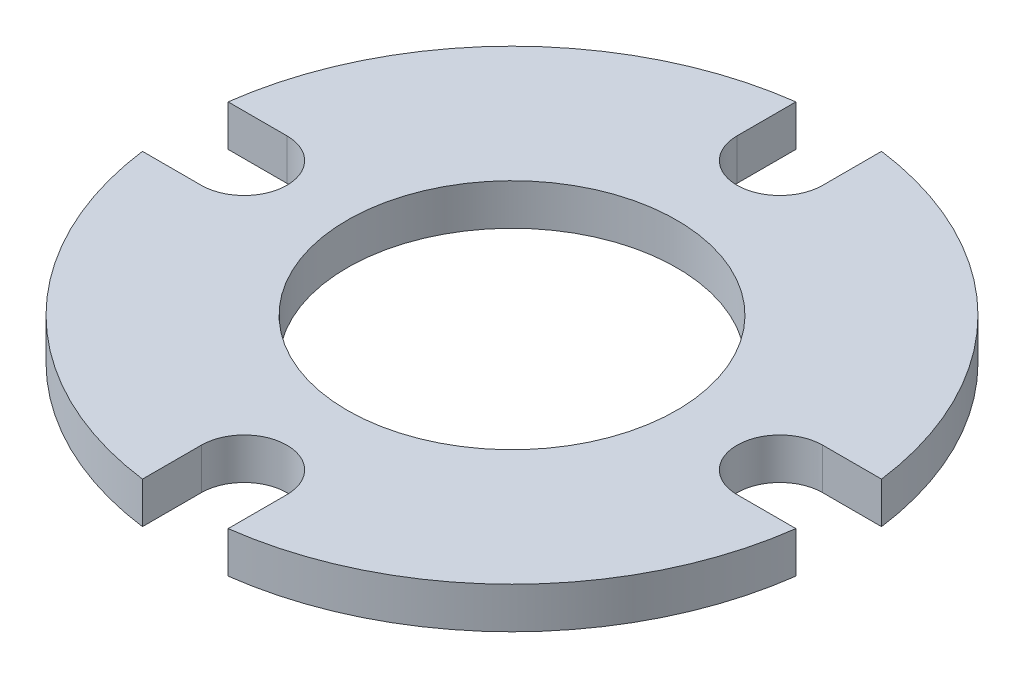
ISO-10303-21;
HEADER;
FILE_DESCRIPTION(('STEP AP214'),'2;1');
FILE_NAME('part.step','',(''),(''),'','','');
FILE_SCHEMA(('AUTOMOTIVE_DESIGN { 1 0 10303 214 1 1 1 1 }'));
ENDSEC;
DATA;
#1=APPLICATION_CONTEXT('core data for automotive mechanical design processes');
#2=APPLICATION_PROTOCOL_DEFINITION('international standard','automotive_design',2000,#1);
#3=PRODUCT_CONTEXT('',#1,'mechanical');
#4=PRODUCT('Part','Part','',(#3));
#5=PRODUCT_RELATED_PRODUCT_CATEGORY('part','',(#4));
#6=PRODUCT_DEFINITION_FORMATION('','',#4);
#7=PRODUCT_DEFINITION_CONTEXT('part definition',#1,'design');
#8=PRODUCT_DEFINITION('design','',#6,#7);
#9=PRODUCT_DEFINITION_SHAPE('','',#8);
#10=(LENGTH_UNIT() NAMED_UNIT(*) SI_UNIT(.MILLI.,.METRE.));
#11=(NAMED_UNIT(*) PLANE_ANGLE_UNIT() SI_UNIT($,.RADIAN.));
#12=(NAMED_UNIT(*) SI_UNIT($,.STERADIAN.) SOLID_ANGLE_UNIT());
#13=UNCERTAINTY_MEASURE_WITH_UNIT(LENGTH_MEASURE(1.E-05),#10,'distance_accuracy_value','');
#14=(GEOMETRIC_REPRESENTATION_CONTEXT(3) GLOBAL_UNCERTAINTY_ASSIGNED_CONTEXT((#13)) GLOBAL_UNIT_ASSIGNED_CONTEXT((#10,
#11,#12)) REPRESENTATION_CONTEXT('',''));
#15=CARTESIAN_POINT('',(0.,0.,0.));
#16=DIRECTION('',(0.,0.,1.));
#17=DIRECTION('',(1.,0.,0.));
#18=AXIS2_PLACEMENT_3D('',#15,#16,#17);
#19=CARTESIAN_POINT('',(0.813,0.0625,0.));
#20=DIRECTION('',(0.,1.,0.));
#21=DIRECTION('',(0.,0.,1.));
#22=AXIS2_PLACEMENT_3D('',#19,#20,#21);
#23=PLANE('',#22);
#24=CARTESIAN_POINT('',(0.813,0.0625,0.));
#25=DIRECTION('',(0.,-1.,0.));
#26=DIRECTION('',(0.,0.,1.));
#27=AXIS2_PLACEMENT_3D('',#24,#25,#26);
#28=CIRCLE('',#27,0.13);
#29=CARTESIAN_POINT('',(0.813,0.0625,0.13));
#30=VERTEX_POINT('',#29);
#31=CARTESIAN_POINT('',(0.813,0.0625,-0.13));
#32=VERTEX_POINT('',#31);
#33=EDGE_CURVE('E213',#30,#32,#28,.T.);
#34=ORIENTED_EDGE('',*,*,#33,.T.);
#35=DIRECTION('',(1.,0.,0.));
#36=VECTOR('',#35,1.);
#37=CARTESIAN_POINT('',(0.813,0.0625,-0.13));
#38=LINE('',#37,#36);
#39=CARTESIAN_POINT('',(0.991513993849809,0.0625,-0.13));
#40=VERTEX_POINT('',#39);
#41=EDGE_CURVE('E121',#32,#40,#38,.T.);
#42=ORIENTED_EDGE('',*,*,#41,.T.);
#43=CARTESIAN_POINT('',(0.,0.0625,0.));
#44=DIRECTION('',(0.,1.,0.));
#45=DIRECTION('',(0.,0.,1.));
#46=AXIS2_PLACEMENT_3D('',#43,#44,#45);
#47=CIRCLE('',#46,1.);
#48=CARTESIAN_POINT('',(0.13,0.0625,-0.991513993849809));
#49=VERTEX_POINT('',#48);
#50=EDGE_CURVE('E252',#40,#49,#47,.T.);
#51=ORIENTED_EDGE('',*,*,#50,.T.);
#52=DIRECTION('',(0.,0.,1.));
#53=VECTOR('',#52,1.);
#54=CARTESIAN_POINT('',(0.13,0.0625,-0.813));
#55=LINE('',#54,#53);
#56=CARTESIAN_POINT('',(0.13,0.0625,-0.813));
#57=VERTEX_POINT('',#56);
#58=EDGE_CURVE('E271',#49,#57,#55,.T.);
#59=ORIENTED_EDGE('',*,*,#58,.T.);
#60=CARTESIAN_POINT('',(0.,0.0625,-0.813));
#61=DIRECTION('',(0.,-1.,0.));
#62=DIRECTION('',(0.,0.,1.));
#63=AXIS2_PLACEMENT_3D('',#60,#61,#62);
#64=CIRCLE('',#63,0.13);
#65=CARTESIAN_POINT('',(-0.13,0.0625,-0.813));
#66=VERTEX_POINT('',#65);
#67=EDGE_CURVE('E268',#57,#66,#64,.T.);
#68=ORIENTED_EDGE('',*,*,#67,.T.);
#69=DIRECTION('',(0.,0.,-1.));
#70=VECTOR('',#69,1.);
#71=CARTESIAN_POINT('',(-0.13,0.0625,-0.813));
#72=LINE('',#71,#70);
#73=CARTESIAN_POINT('',(-0.13,0.0625,-0.991513993849809));
#74=VERTEX_POINT('',#73);
#75=EDGE_CURVE('E270',#66,#74,#72,.T.);
#76=ORIENTED_EDGE('',*,*,#75,.T.);
#77=CARTESIAN_POINT('',(0.,0.0625,0.));
#78=DIRECTION('',(0.,1.,0.));
#79=DIRECTION('',(0.,0.,1.));
#80=AXIS2_PLACEMENT_3D('',#77,#78,#79);
#81=CIRCLE('',#80,1.);
#82=CARTESIAN_POINT('',(-0.991513993849809,0.0625,-0.130000000000001));
#83=VERTEX_POINT('',#82);
#84=EDGE_CURVE('E273',#74,#83,#81,.T.);
#85=ORIENTED_EDGE('',*,*,#84,.T.);
#86=DIRECTION('',(1.,0.,0.));
#87=VECTOR('',#86,1.);
#88=CARTESIAN_POINT('',(-0.813,0.0625,-0.13));
#89=LINE('',#88,#87);
#90=CARTESIAN_POINT('',(-0.813,0.0625,-0.13));
#91=VERTEX_POINT('',#90);
#92=EDGE_CURVE('E279',#83,#91,#89,.T.);
#93=ORIENTED_EDGE('',*,*,#92,.T.);
#94=CARTESIAN_POINT('',(-0.813,0.0625,0.));
#95=DIRECTION('',(0.,-1.,0.));
#96=DIRECTION('',(0.,0.,1.));
#97=AXIS2_PLACEMENT_3D('',#94,#95,#96);
#98=CIRCLE('',#97,0.13);
#99=CARTESIAN_POINT('',(-0.813,0.0625,0.13));
#100=VERTEX_POINT('',#99);
#101=EDGE_CURVE('E281',#91,#100,#98,.T.);
#102=ORIENTED_EDGE('',*,*,#101,.T.);
#103=DIRECTION('',(-1.,0.,0.));
#104=VECTOR('',#103,1.);
#105=CARTESIAN_POINT('',(-0.813,0.0625,0.13));
#106=LINE('',#105,#104);
#107=CARTESIAN_POINT('',(-0.991513993849809,0.0625,0.13));
#108=VERTEX_POINT('',#107);
#109=EDGE_CURVE('E283',#100,#108,#106,.T.);
#110=ORIENTED_EDGE('',*,*,#109,.T.);
#111=CARTESIAN_POINT('',(0.,0.0625,0.));
#112=DIRECTION('',(0.,1.,0.));
#113=DIRECTION('',(0.,0.,1.));
#114=AXIS2_PLACEMENT_3D('',#111,#112,#113);
#115=CIRCLE('',#114,1.);
#116=CARTESIAN_POINT('',(-0.13,0.0625,0.991513993849809));
#117=VERTEX_POINT('',#116);
#118=EDGE_CURVE('E285',#108,#117,#115,.T.);
#119=ORIENTED_EDGE('',*,*,#118,.T.);
#120=DIRECTION('',(0.,0.,-1.));
#121=VECTOR('',#120,1.);
#122=CARTESIAN_POINT('',(-0.13,0.0625,0.813));
#123=LINE('',#122,#121);
#124=CARTESIAN_POINT('',(-0.13,0.0625,0.813));
#125=VERTEX_POINT('',#124);
#126=EDGE_CURVE('E287',#117,#125,#123,.T.);
#127=ORIENTED_EDGE('',*,*,#126,.T.);
#128=CARTESIAN_POINT('',(0.,0.0625,0.813));
#129=DIRECTION('',(0.,-1.,0.));
#130=DIRECTION('',(0.,0.,1.));
#131=AXIS2_PLACEMENT_3D('',#128,#129,#130);
#132=CIRCLE('',#131,0.13);
#133=CARTESIAN_POINT('',(0.13,0.0625,0.813));
#134=VERTEX_POINT('',#133);
#135=EDGE_CURVE('E164',#125,#134,#132,.T.);
#136=ORIENTED_EDGE('',*,*,#135,.T.);
#137=DIRECTION('',(0.,0.,1.));
#138=VECTOR('',#137,1.);
#139=CARTESIAN_POINT('',(0.13,0.0625,0.813));
#140=LINE('',#139,#138);
#141=CARTESIAN_POINT('',(0.13,0.0625,0.991513993849809));
#142=VERTEX_POINT('',#141);
#143=EDGE_CURVE('E158',#134,#142,#140,.T.);
#144=ORIENTED_EDGE('',*,*,#143,.T.);
#145=CARTESIAN_POINT('',(0.,0.0625,0.));
#146=DIRECTION('',(0.,1.,0.));
#147=DIRECTION('',(0.,0.,1.));
#148=AXIS2_PLACEMENT_3D('',#145,#146,#147);
#149=CIRCLE('',#148,1.);
#150=CARTESIAN_POINT('',(0.991513993849809,0.0625,0.13));
#151=VERTEX_POINT('',#150);
#152=EDGE_CURVE('E162',#142,#151,#149,.T.);
#153=ORIENTED_EDGE('',*,*,#152,.T.);
#154=DIRECTION('',(-1.,0.,0.));
#155=VECTOR('',#154,1.);
#156=CARTESIAN_POINT('',(0.813,0.0625,0.13));
#157=LINE('',#156,#155);
#158=EDGE_CURVE('E54',#151,#30,#157,.T.);
#159=ORIENTED_EDGE('',*,*,#158,.T.);
#160=EDGE_LOOP('',(#34,#42,#51,#59,#68,#76,#85,#93,#102,#110,#119,#127,#136,#144,#153,#159));
#161=FACE_BOUND('',#160,.T.);
#162=CARTESIAN_POINT('',(0.,0.0625,0.));
#163=DIRECTION('',(0.,1.,0.));
#164=DIRECTION('',(0.,0.,1.));
#165=AXIS2_PLACEMENT_3D('',#162,#163,#164);
#166=CIRCLE('',#165,0.5);
#167=CARTESIAN_POINT('',(0.,0.0625,0.5));
#168=VERTEX_POINT('',#167);
#169=EDGE_CURVE('E186',#168,#168,#166,.T.);
#170=ORIENTED_EDGE('',*,*,#169,.F.);
#171=EDGE_LOOP('',(#170));
#172=FACE_BOUND('',#171,.T.);
#173=ADVANCED_FACE('F37',(#161,#172),#23,.T.);
#174=CARTESIAN_POINT('',(0.813,-0.0625,0.));
#175=DIRECTION('',(0.,1.,0.));
#176=DIRECTION('',(0.,0.,1.));
#177=AXIS2_PLACEMENT_3D('',#174,#175,#176);
#178=PLANE('',#177);
#179=CARTESIAN_POINT('',(0.813,-0.0625,0.));
#180=DIRECTION('',(0.,-1.,0.));
#181=DIRECTION('',(0.,0.,1.));
#182=AXIS2_PLACEMENT_3D('',#179,#180,#181);
#183=CIRCLE('',#182,0.13);
#184=CARTESIAN_POINT('',(0.813,-0.0625,0.13));
#185=VERTEX_POINT('',#184);
#186=CARTESIAN_POINT('',(0.813,-0.0625,-0.13));
#187=VERTEX_POINT('',#186);
#188=EDGE_CURVE('E182',#185,#187,#183,.T.);
#189=ORIENTED_EDGE('',*,*,#188,.F.);
#190=DIRECTION('',(-1.,0.,0.));
#191=VECTOR('',#190,1.);
#192=CARTESIAN_POINT('',(0.813,-0.0625,0.13));
#193=LINE('',#192,#191);
#194=CARTESIAN_POINT('',(0.991513993849809,-0.0625,0.13));
#195=VERTEX_POINT('',#194);
#196=EDGE_CURVE('E113',#195,#185,#193,.T.);
#197=ORIENTED_EDGE('',*,*,#196,.F.);
#198=CARTESIAN_POINT('',(0.,-0.0625,0.));
#199=DIRECTION('',(0.,1.,0.));
#200=DIRECTION('',(0.,0.,1.));
#201=AXIS2_PLACEMENT_3D('',#198,#199,#200);
#202=CIRCLE('',#201,1.);
#203=CARTESIAN_POINT('',(0.13,-0.0625,0.991513993849809));
#204=VERTEX_POINT('',#203);
#205=EDGE_CURVE('E107',#204,#195,#202,.T.);
#206=ORIENTED_EDGE('',*,*,#205,.F.);
#207=DIRECTION('',(0.,0.,1.));
#208=VECTOR('',#207,1.);
#209=CARTESIAN_POINT('',(0.13,-0.0625,0.813));
#210=LINE('',#209,#208);
#211=CARTESIAN_POINT('',(0.13,-0.0625,0.813));
#212=VERTEX_POINT('',#211);
#213=EDGE_CURVE('E172',#212,#204,#210,.T.);
#214=ORIENTED_EDGE('',*,*,#213,.F.);
#215=CARTESIAN_POINT('',(0.,-0.0625,0.813));
#216=DIRECTION('',(0.,-1.,0.));
#217=DIRECTION('',(0.,0.,1.));
#218=AXIS2_PLACEMENT_3D('',#215,#216,#217);
#219=CIRCLE('',#218,0.13);
#220=CARTESIAN_POINT('',(-0.13,-0.0625,0.813));
#221=VERTEX_POINT('',#220);
#222=EDGE_CURVE('E208',#221,#212,#219,.T.);
#223=ORIENTED_EDGE('',*,*,#222,.F.);
#224=DIRECTION('',(0.,0.,-1.));
#225=VECTOR('',#224,1.);
#226=CARTESIAN_POINT('',(-0.13,-0.0625,0.813));
#227=LINE('',#226,#225);
#228=CARTESIAN_POINT('',(-0.13,-0.0625,0.991513993849809));
#229=VERTEX_POINT('',#228);
#230=EDGE_CURVE('E206',#229,#221,#227,.T.);
#231=ORIENTED_EDGE('',*,*,#230,.F.);
#232=CARTESIAN_POINT('',(0.,-0.0625,0.));
#233=DIRECTION('',(0.,1.,0.));
#234=DIRECTION('',(0.,0.,1.));
#235=AXIS2_PLACEMENT_3D('',#232,#233,#234);
#236=CIRCLE('',#235,1.);
#237=CARTESIAN_POINT('',(-0.991513993849809,-0.0625,0.13));
#238=VERTEX_POINT('',#237);
#239=EDGE_CURVE('E204',#238,#229,#236,.T.);
#240=ORIENTED_EDGE('',*,*,#239,.F.);
#241=DIRECTION('',(-1.,0.,0.));
#242=VECTOR('',#241,1.);
#243=CARTESIAN_POINT('',(-0.813,-0.0625,0.13));
#244=LINE('',#243,#242);
#245=CARTESIAN_POINT('',(-0.813,-0.0625,0.13));
#246=VERTEX_POINT('',#245);
#247=EDGE_CURVE('E202',#246,#238,#244,.T.);
#248=ORIENTED_EDGE('',*,*,#247,.F.);
#249=CARTESIAN_POINT('',(-0.813,-0.0625,0.));
#250=DIRECTION('',(0.,-1.,0.));
#251=DIRECTION('',(0.,0.,1.));
#252=AXIS2_PLACEMENT_3D('',#249,#250,#251);
#253=CIRCLE('',#252,0.13);
#254=CARTESIAN_POINT('',(-0.813,-0.0625,-0.13));
#255=VERTEX_POINT('',#254);
#256=EDGE_CURVE('E200',#255,#246,#253,.T.);
#257=ORIENTED_EDGE('',*,*,#256,.F.);
#258=DIRECTION('',(1.,0.,0.));
#259=VECTOR('',#258,1.);
#260=CARTESIAN_POINT('',(-0.813,-0.0625,-0.13));
#261=LINE('',#260,#259);
#262=CARTESIAN_POINT('',(-0.991513993849809,-0.0625,-0.130000000000001));
#263=VERTEX_POINT('',#262);
#264=EDGE_CURVE('E198',#263,#255,#261,.T.);
#265=ORIENTED_EDGE('',*,*,#264,.F.);
#266=CARTESIAN_POINT('',(0.,-0.0625,0.));
#267=DIRECTION('',(0.,1.,0.));
#268=DIRECTION('',(0.,0.,1.));
#269=AXIS2_PLACEMENT_3D('',#266,#267,#268);
#270=CIRCLE('',#269,1.);
#271=CARTESIAN_POINT('',(-0.13,-0.0625,-0.991513993849809));
#272=VERTEX_POINT('',#271);
#273=EDGE_CURVE('E196',#272,#263,#270,.T.);
#274=ORIENTED_EDGE('',*,*,#273,.F.);
#275=DIRECTION('',(0.,0.,-1.));
#276=VECTOR('',#275,1.);
#277=CARTESIAN_POINT('',(-0.13,-0.0625,-0.813));
#278=LINE('',#277,#276);
#279=CARTESIAN_POINT('',(-0.13,-0.0625,-0.813));
#280=VERTEX_POINT('',#279);
#281=EDGE_CURVE('E194',#280,#272,#278,.T.);
#282=ORIENTED_EDGE('',*,*,#281,.F.);
#283=CARTESIAN_POINT('',(0.,-0.0625,-0.813));
#284=DIRECTION('',(0.,-1.,0.));
#285=DIRECTION('',(0.,0.,1.));
#286=AXIS2_PLACEMENT_3D('',#283,#284,#285);
#287=CIRCLE('',#286,0.13);
#288=CARTESIAN_POINT('',(0.13,-0.0625,-0.813));
#289=VERTEX_POINT('',#288);
#290=EDGE_CURVE('E192',#289,#280,#287,.T.);
#291=ORIENTED_EDGE('',*,*,#290,.F.);
#292=DIRECTION('',(0.,0.,1.));
#293=VECTOR('',#292,1.);
#294=CARTESIAN_POINT('',(0.13,-0.0625,-0.813));
#295=LINE('',#294,#293);
#296=CARTESIAN_POINT('',(0.13,-0.0625,-0.991513993849809));
#297=VERTEX_POINT('',#296);
#298=EDGE_CURVE('E190',#297,#289,#295,.T.);
#299=ORIENTED_EDGE('',*,*,#298,.F.);
#300=CARTESIAN_POINT('',(0.,-0.0625,0.));
#301=DIRECTION('',(0.,1.,0.));
#302=DIRECTION('',(0.,0.,1.));
#303=AXIS2_PLACEMENT_3D('',#300,#301,#302);
#304=CIRCLE('',#303,1.);
#305=CARTESIAN_POINT('',(0.991513993849809,-0.0625,-0.13));
#306=VERTEX_POINT('',#305);
#307=EDGE_CURVE('E188',#306,#297,#304,.T.);
#308=ORIENTED_EDGE('',*,*,#307,.F.);
#309=DIRECTION('',(1.,0.,0.));
#310=VECTOR('',#309,1.);
#311=CARTESIAN_POINT('',(0.813,-0.0625,-0.13));
#312=LINE('',#311,#310);
#313=EDGE_CURVE('E185',#187,#306,#312,.T.);
#314=ORIENTED_EDGE('',*,*,#313,.F.);
#315=EDGE_LOOP('',(#189,#197,#206,#214,#223,#231,#240,#248,#257,#265,#274,#282,#291,#299,#308,#314));
#316=FACE_BOUND('',#315,.T.);
#317=CARTESIAN_POINT('',(0.,-0.0625,0.));
#318=DIRECTION('',(0.,1.,0.));
#319=DIRECTION('',(0.,0.,1.));
#320=AXIS2_PLACEMENT_3D('',#317,#318,#319);
#321=CIRCLE('',#320,0.5);
#322=CARTESIAN_POINT('',(0.,-0.0625,0.5));
#323=VERTEX_POINT('',#322);
#324=EDGE_CURVE('E524',#323,#323,#321,.T.);
#325=ORIENTED_EDGE('',*,*,#324,.T.);
#326=EDGE_LOOP('',(#325));
#327=FACE_BOUND('',#326,.T.);
#328=ADVANCED_FACE('F256',(#316,#327),#178,.F.);
#329=CARTESIAN_POINT('',(0.813,0.0625,0.));
#330=DIRECTION('',(0.,-1.,0.));
#331=DIRECTION('',(0.,0.,-1.));
#332=AXIS2_PLACEMENT_3D('',#329,#330,#331);
#333=CYLINDRICAL_SURFACE('',#332,0.13);
#334=ORIENTED_EDGE('',*,*,#188,.T.);
#335=DIRECTION('',(0.,-1.,0.));
#336=VECTOR('',#335,1.);
#337=CARTESIAN_POINT('',(0.813,0.0625,-0.13));
#338=LINE('',#337,#336);
#339=EDGE_CURVE('E11',#32,#187,#338,.T.);
#340=ORIENTED_EDGE('',*,*,#339,.F.);
#341=ORIENTED_EDGE('',*,*,#33,.F.);
#342=DIRECTION('',(0.,-1.,0.));
#343=VECTOR('',#342,1.);
#344=CARTESIAN_POINT('',(0.813,0.0625,0.13));
#345=LINE('',#344,#343);
#346=EDGE_CURVE('E178',#30,#185,#345,.T.);
#347=ORIENTED_EDGE('',*,*,#346,.T.);
#348=EDGE_LOOP('',(#334,#340,#341,#347));
#349=FACE_BOUND('',#348,.T.);
#350=ADVANCED_FACE('F39',(#349),#333,.F.);
#351=CARTESIAN_POINT('',(0.813,0.0625,-0.13));
#352=DIRECTION('',(0.,0.,-1.));
#353=DIRECTION('',(-1.,0.,0.));
#354=AXIS2_PLACEMENT_3D('',#351,#352,#353);
#355=PLANE('',#354);
#356=ORIENTED_EDGE('',*,*,#313,.T.);
#357=DIRECTION('',(0.,-1.,0.));
#358=VECTOR('',#357,1.);
#359=CARTESIAN_POINT('',(0.991513993849809,0.0625,-0.13));
#360=LINE('',#359,#358);
#361=EDGE_CURVE('E46',#40,#306,#360,.T.);
#362=ORIENTED_EDGE('',*,*,#361,.F.);
#363=ORIENTED_EDGE('',*,*,#41,.F.);
#364=ORIENTED_EDGE('',*,*,#339,.T.);
#365=EDGE_LOOP('',(#356,#362,#363,#364));
#366=FACE_BOUND('',#365,.T.);
#367=ADVANCED_FACE('F321',(#366),#355,.F.);
#368=CARTESIAN_POINT('',(0.,0.0625,0.));
#369=DIRECTION('',(0.,-1.,0.));
#370=DIRECTION('',(0.,0.,-1.));
#371=AXIS2_PLACEMENT_3D('',#368,#369,#370);
#372=CYLINDRICAL_SURFACE('',#371,1.);
#373=ORIENTED_EDGE('',*,*,#307,.T.);
#374=DIRECTION('',(0.,-1.,0.));
#375=VECTOR('',#374,1.);
#376=CARTESIAN_POINT('',(0.13,0.0625,-0.991513993849809));
#377=LINE('',#376,#375);
#378=EDGE_CURVE('E244',#49,#297,#377,.T.);
#379=ORIENTED_EDGE('',*,*,#378,.F.);
#380=ORIENTED_EDGE('',*,*,#50,.F.);
#381=ORIENTED_EDGE('',*,*,#361,.T.);
#382=EDGE_LOOP('',(#373,#379,#380,#381));
#383=FACE_BOUND('',#382,.T.);
#384=ADVANCED_FACE('F250',(#383),#372,.T.);
#385=CARTESIAN_POINT('',(0.13,0.0625,-0.813));
#386=DIRECTION('',(1.,0.,0.));
#387=DIRECTION('',(0.,0.,-1.));
#388=AXIS2_PLACEMENT_3D('',#385,#386,#387);
#389=PLANE('',#388);
#390=ORIENTED_EDGE('',*,*,#298,.T.);
#391=DIRECTION('',(0.,-1.,0.));
#392=VECTOR('',#391,1.);
#393=CARTESIAN_POINT('',(0.13,0.0625,-0.813));
#394=LINE('',#393,#392);
#395=EDGE_CURVE('E241',#57,#289,#394,.T.);
#396=ORIENTED_EDGE('',*,*,#395,.F.);
#397=ORIENTED_EDGE('',*,*,#58,.F.);
#398=ORIENTED_EDGE('',*,*,#378,.T.);
#399=EDGE_LOOP('',(#390,#396,#397,#398));
#400=FACE_BOUND('',#399,.T.);
#401=ADVANCED_FACE('F262',(#400),#389,.F.);
#402=CARTESIAN_POINT('',(0.,0.0625,-0.813));
#403=DIRECTION('',(0.,-1.,0.));
#404=DIRECTION('',(0.,0.,-1.));
#405=AXIS2_PLACEMENT_3D('',#402,#403,#404);
#406=CYLINDRICAL_SURFACE('',#405,0.13);
#407=ORIENTED_EDGE('',*,*,#290,.T.);
#408=DIRECTION('',(0.,-1.,0.));
#409=VECTOR('',#408,1.);
#410=CARTESIAN_POINT('',(-0.13,0.0625,-0.813));
#411=LINE('',#410,#409);
#412=EDGE_CURVE('E238',#66,#280,#411,.T.);
#413=ORIENTED_EDGE('',*,*,#412,.F.);
#414=ORIENTED_EDGE('',*,*,#67,.F.);
#415=ORIENTED_EDGE('',*,*,#395,.T.);
#416=EDGE_LOOP('',(#407,#413,#414,#415));
#417=FACE_BOUND('',#416,.T.);
#418=ADVANCED_FACE('F266',(#417),#406,.F.);
#419=CARTESIAN_POINT('',(-0.13,0.0625,-0.813));
#420=DIRECTION('',(-1.,0.,0.));
#421=DIRECTION('',(0.,0.,1.));
#422=AXIS2_PLACEMENT_3D('',#419,#420,#421);
#423=PLANE('',#422);
#424=ORIENTED_EDGE('',*,*,#281,.T.);
#425=DIRECTION('',(0.,-1.,0.));
#426=VECTOR('',#425,1.);
#427=CARTESIAN_POINT('',(-0.13,0.0625,-0.991513993849809));
#428=LINE('',#427,#426);
#429=EDGE_CURVE('E235',#74,#272,#428,.T.);
#430=ORIENTED_EDGE('',*,*,#429,.F.);
#431=ORIENTED_EDGE('',*,*,#75,.F.);
#432=ORIENTED_EDGE('',*,*,#412,.T.);
#433=EDGE_LOOP('',(#424,#430,#431,#432));
#434=FACE_BOUND('',#433,.T.);
#435=ADVANCED_FACE('F334',(#434),#423,.F.);
#436=CARTESIAN_POINT('',(0.,0.0625,0.));
#437=DIRECTION('',(0.,-1.,0.));
#438=DIRECTION('',(0.,0.,-1.));
#439=AXIS2_PLACEMENT_3D('',#436,#437,#438);
#440=CYLINDRICAL_SURFACE('',#439,1.);
#441=ORIENTED_EDGE('',*,*,#273,.T.);
#442=DIRECTION('',(0.,-1.,0.));
#443=VECTOR('',#442,1.);
#444=CARTESIAN_POINT('',(-0.991513993849809,0.0625,-0.130000000000001));
#445=LINE('',#444,#443);
#446=EDGE_CURVE('E232',#83,#263,#445,.T.);
#447=ORIENTED_EDGE('',*,*,#446,.F.);
#448=ORIENTED_EDGE('',*,*,#84,.F.);
#449=ORIENTED_EDGE('',*,*,#429,.T.);
#450=EDGE_LOOP('',(#441,#447,#448,#449));
#451=FACE_BOUND('',#450,.T.);
#452=ADVANCED_FACE('F337',(#451),#440,.T.);
#453=CARTESIAN_POINT('',(-0.813,0.0625,-0.13));
#454=DIRECTION('',(0.,0.,-1.));
#455=DIRECTION('',(-1.,0.,0.));
#456=AXIS2_PLACEMENT_3D('',#453,#454,#455);
#457=PLANE('',#456);
#458=ORIENTED_EDGE('',*,*,#264,.T.);
#459=DIRECTION('',(0.,-1.,0.));
#460=VECTOR('',#459,1.);
#461=CARTESIAN_POINT('',(-0.813,0.0625,-0.13));
#462=LINE('',#461,#460);
#463=EDGE_CURVE('E229',#91,#255,#462,.T.);
#464=ORIENTED_EDGE('',*,*,#463,.F.);
#465=ORIENTED_EDGE('',*,*,#92,.F.);
#466=ORIENTED_EDGE('',*,*,#446,.T.);
#467=EDGE_LOOP('',(#458,#464,#465,#466));
#468=FACE_BOUND('',#467,.T.);
#469=ADVANCED_FACE('F341',(#468),#457,.F.);
#470=CARTESIAN_POINT('',(-0.813,0.0625,0.));
#471=DIRECTION('',(0.,-1.,0.));
#472=DIRECTION('',(0.,0.,-1.));
#473=AXIS2_PLACEMENT_3D('',#470,#471,#472);
#474=CYLINDRICAL_SURFACE('',#473,0.13);
#475=ORIENTED_EDGE('',*,*,#256,.T.);
#476=DIRECTION('',(0.,-1.,0.));
#477=VECTOR('',#476,1.);
#478=CARTESIAN_POINT('',(-0.813,0.0625,0.13));
#479=LINE('',#478,#477);
#480=EDGE_CURVE('E226',#100,#246,#479,.T.);
#481=ORIENTED_EDGE('',*,*,#480,.F.);
#482=ORIENTED_EDGE('',*,*,#101,.F.);
#483=ORIENTED_EDGE('',*,*,#463,.T.);
#484=EDGE_LOOP('',(#475,#481,#482,#483));
#485=FACE_BOUND('',#484,.T.);
#486=ADVANCED_FACE('F345',(#485),#474,.F.);
#487=CARTESIAN_POINT('',(-0.813,0.0625,0.13));
#488=DIRECTION('',(0.,0.,1.));
#489=DIRECTION('',(1.,0.,0.));
#490=AXIS2_PLACEMENT_3D('',#487,#488,#489);
#491=PLANE('',#490);
#492=ORIENTED_EDGE('',*,*,#247,.T.);
#493=DIRECTION('',(0.,-1.,0.));
#494=VECTOR('',#493,1.);
#495=CARTESIAN_POINT('',(-0.991513993849809,0.0625,0.13));
#496=LINE('',#495,#494);
#497=EDGE_CURVE('E223',#108,#238,#496,.T.);
#498=ORIENTED_EDGE('',*,*,#497,.F.);
#499=ORIENTED_EDGE('',*,*,#109,.F.);
#500=ORIENTED_EDGE('',*,*,#480,.T.);
#501=EDGE_LOOP('',(#492,#498,#499,#500));
#502=FACE_BOUND('',#501,.T.);
#503=ADVANCED_FACE('F349',(#502),#491,.F.);
#504=CARTESIAN_POINT('',(0.,0.0625,0.));
#505=DIRECTION('',(0.,-1.,0.));
#506=DIRECTION('',(0.,0.,-1.));
#507=AXIS2_PLACEMENT_3D('',#504,#505,#506);
#508=CYLINDRICAL_SURFACE('',#507,1.);
#509=ORIENTED_EDGE('',*,*,#239,.T.);
#510=DIRECTION('',(0.,-1.,0.));
#511=VECTOR('',#510,1.);
#512=CARTESIAN_POINT('',(-0.13,0.0625,0.991513993849809));
#513=LINE('',#512,#511);
#514=EDGE_CURVE('E220',#117,#229,#513,.T.);
#515=ORIENTED_EDGE('',*,*,#514,.F.);
#516=ORIENTED_EDGE('',*,*,#118,.F.);
#517=ORIENTED_EDGE('',*,*,#497,.T.);
#518=EDGE_LOOP('',(#509,#515,#516,#517));
#519=FACE_BOUND('',#518,.T.);
#520=ADVANCED_FACE('F353',(#519),#508,.T.);
#521=CARTESIAN_POINT('',(-0.13,0.0625,0.813));
#522=DIRECTION('',(-1.,0.,0.));
#523=DIRECTION('',(0.,0.,1.));
#524=AXIS2_PLACEMENT_3D('',#521,#522,#523);
#525=PLANE('',#524);
#526=ORIENTED_EDGE('',*,*,#230,.T.);
#527=DIRECTION('',(0.,-1.,0.));
#528=VECTOR('',#527,1.);
#529=CARTESIAN_POINT('',(-0.13,0.0625,0.813));
#530=LINE('',#529,#528);
#531=EDGE_CURVE('E217',#125,#221,#530,.T.);
#532=ORIENTED_EDGE('',*,*,#531,.F.);
#533=ORIENTED_EDGE('',*,*,#126,.F.);
#534=ORIENTED_EDGE('',*,*,#514,.T.);
#535=EDGE_LOOP('',(#526,#532,#533,#534));
#536=FACE_BOUND('',#535,.T.);
#537=ADVANCED_FACE('F293',(#536),#525,.F.);
#538=CARTESIAN_POINT('',(0.,0.0625,0.813));
#539=DIRECTION('',(0.,-1.,0.));
#540=DIRECTION('',(0.,0.,-1.));
#541=AXIS2_PLACEMENT_3D('',#538,#539,#540);
#542=CYLINDRICAL_SURFACE('',#541,0.13);
#543=ORIENTED_EDGE('',*,*,#222,.T.);
#544=DIRECTION('',(0.,-1.,0.));
#545=VECTOR('',#544,1.);
#546=CARTESIAN_POINT('',(0.13,0.0625,0.813));
#547=LINE('',#546,#545);
#548=EDGE_CURVE('E173',#134,#212,#547,.T.);
#549=ORIENTED_EDGE('',*,*,#548,.F.);
#550=ORIENTED_EDGE('',*,*,#135,.F.);
#551=ORIENTED_EDGE('',*,*,#531,.T.);
#552=EDGE_LOOP('',(#543,#549,#550,#551));
#553=FACE_BOUND('',#552,.T.);
#554=ADVANCED_FACE('F297',(#553),#542,.F.);
#555=CARTESIAN_POINT('',(0.13,0.0625,0.813));
#556=DIRECTION('',(1.,0.,0.));
#557=DIRECTION('',(0.,0.,-1.));
#558=AXIS2_PLACEMENT_3D('',#555,#556,#557);
#559=PLANE('',#558);
#560=ORIENTED_EDGE('',*,*,#213,.T.);
#561=DIRECTION('',(0.,-1.,0.));
#562=VECTOR('',#561,1.);
#563=CARTESIAN_POINT('',(0.13,0.0625,0.991513993849809));
#564=LINE('',#563,#562);
#565=EDGE_CURVE('E169',#142,#204,#564,.T.);
#566=ORIENTED_EDGE('',*,*,#565,.F.);
#567=ORIENTED_EDGE('',*,*,#143,.F.);
#568=ORIENTED_EDGE('',*,*,#548,.T.);
#569=EDGE_LOOP('',(#560,#566,#567,#568));
#570=FACE_BOUND('',#569,.T.);
#571=ADVANCED_FACE('F170',(#570),#559,.F.);
#572=CARTESIAN_POINT('',(0.,0.0625,0.));
#573=DIRECTION('',(0.,-1.,0.));
#574=DIRECTION('',(0.,0.,-1.));
#575=AXIS2_PLACEMENT_3D('',#572,#573,#574);
#576=CYLINDRICAL_SURFACE('',#575,1.);
#577=ORIENTED_EDGE('',*,*,#205,.T.);
#578=DIRECTION('',(0.,-1.,0.));
#579=VECTOR('',#578,1.);
#580=CARTESIAN_POINT('',(0.991513993849809,0.0625,0.13));
#581=LINE('',#580,#579);
#582=EDGE_CURVE('E174',#151,#195,#581,.T.);
#583=ORIENTED_EDGE('',*,*,#582,.F.);
#584=ORIENTED_EDGE('',*,*,#152,.F.);
#585=ORIENTED_EDGE('',*,*,#565,.T.);
#586=EDGE_LOOP('',(#577,#583,#584,#585));
#587=FACE_BOUND('',#586,.T.);
#588=ADVANCED_FACE('F176',(#587),#576,.T.);
#589=CARTESIAN_POINT('',(0.813,0.0625,0.13));
#590=DIRECTION('',(0.,0.,1.));
#591=DIRECTION('',(1.,0.,0.));
#592=AXIS2_PLACEMENT_3D('',#589,#590,#591);
#593=PLANE('',#592);
#594=ORIENTED_EDGE('',*,*,#196,.T.);
#595=ORIENTED_EDGE('',*,*,#346,.F.);
#596=ORIENTED_EDGE('',*,*,#158,.F.);
#597=ORIENTED_EDGE('',*,*,#582,.T.);
#598=EDGE_LOOP('',(#594,#595,#596,#597));
#599=FACE_BOUND('',#598,.T.);
#600=ADVANCED_FACE('F301',(#599),#593,.F.);
#601=CARTESIAN_POINT('',(0.,0.0625,0.));
#602=DIRECTION('',(0.,-1.,0.));
#603=DIRECTION('',(0.,0.,-1.));
#604=AXIS2_PLACEMENT_3D('',#601,#602,#603);
#605=CYLINDRICAL_SURFACE('',#604,0.5);
#606=ORIENTED_EDGE('',*,*,#169,.T.);
#607=EDGE_LOOP('',(#606));
#608=FACE_BOUND('',#607,.T.);
#609=ORIENTED_EDGE('',*,*,#324,.F.);
#610=EDGE_LOOP('',(#609));
#611=FACE_BOUND('',#610,.T.);
#612=ADVANCED_FACE('F303',(#608,#611),#605,.F.);
#613=CLOSED_SHELL('',(#173,#328,#350,#367,#384,#401,#418,#435,#452,#469,#486,#503,#520,#537,
#554,#571,#588,#600,#612));
#614=MANIFOLD_SOLID_BREP('B2',#613);
#615=ADVANCED_BREP_SHAPE_REPRESENTATION('',(#18,#614),#14);
#616=SHAPE_DEFINITION_REPRESENTATION(#9,#615);
ENDSEC;
END-ISO-10303-21;
